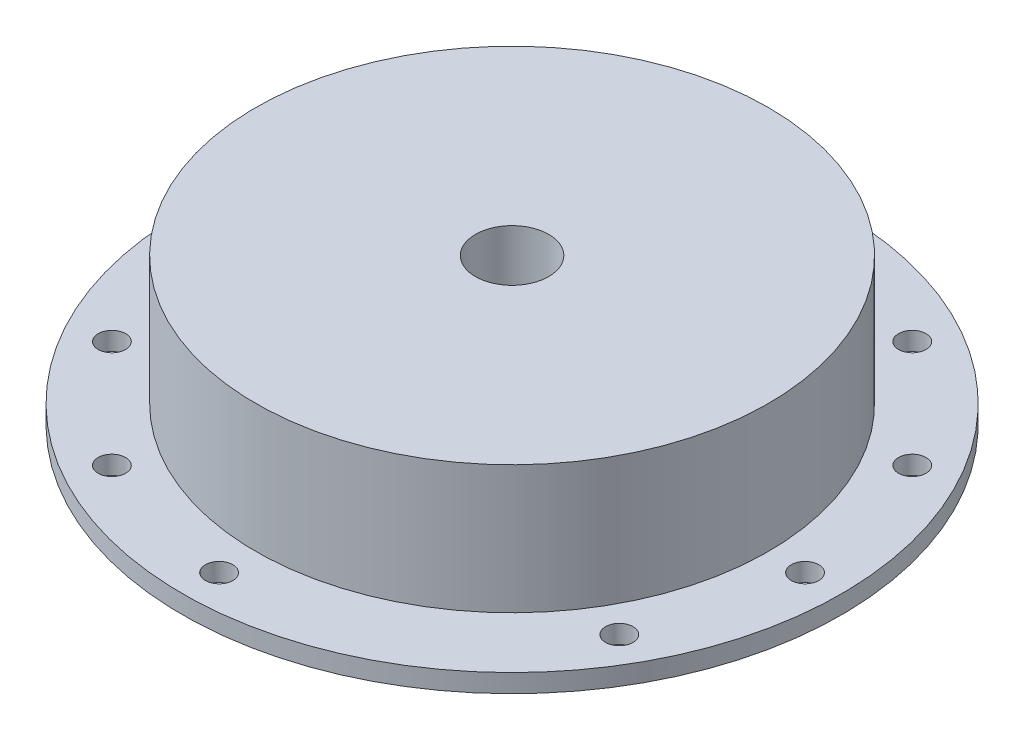
ISO-10303-21;
HEADER;
FILE_DESCRIPTION(('STEP AP214'),'2;1');
FILE_NAME('part.step','',(''),(''),'','','');
FILE_SCHEMA(('AUTOMOTIVE_DESIGN { 1 0 10303 214 1 1 1 1 }'));
ENDSEC;
DATA;
#1=APPLICATION_CONTEXT('core data for automotive mechanical design processes');
#2=APPLICATION_PROTOCOL_DEFINITION('international standard','automotive_design',2000,#1);
#3=PRODUCT_CONTEXT('',#1,'mechanical');
#4=PRODUCT('Part','Part','',(#3));
#5=PRODUCT_RELATED_PRODUCT_CATEGORY('part','',(#4));
#6=PRODUCT_DEFINITION_FORMATION('','',#4);
#7=PRODUCT_DEFINITION_CONTEXT('part definition',#1,'design');
#8=PRODUCT_DEFINITION('design','',#6,#7);
#9=PRODUCT_DEFINITION_SHAPE('','',#8);
#10=(LENGTH_UNIT() NAMED_UNIT(*) SI_UNIT(.MILLI.,.METRE.));
#11=(NAMED_UNIT(*) PLANE_ANGLE_UNIT() SI_UNIT($,.RADIAN.));
#12=(NAMED_UNIT(*) SI_UNIT($,.STERADIAN.) SOLID_ANGLE_UNIT());
#13=UNCERTAINTY_MEASURE_WITH_UNIT(LENGTH_MEASURE(1.E-05),#10,'distance_accuracy_value','');
#14=(GEOMETRIC_REPRESENTATION_CONTEXT(3) GLOBAL_UNCERTAINTY_ASSIGNED_CONTEXT((#13)) GLOBAL_UNIT_ASSIGNED_CONTEXT((#10,
#11,#12)) REPRESENTATION_CONTEXT('',''));
#15=CARTESIAN_POINT('',(0.,0.,0.));
#16=DIRECTION('',(0.,0.,1.));
#17=DIRECTION('',(1.,0.,0.));
#18=AXIS2_PLACEMENT_3D('',#15,#16,#17);
#19=CARTESIAN_POINT('',(88.9,50.8,0.));
#20=DIRECTION('',(0.,1.,0.));
#21=DIRECTION('',(0.,0.,1.));
#22=AXIS2_PLACEMENT_3D('',#19,#20,#21);
#23=PLANE('',#22);
#24=CARTESIAN_POINT('',(0.,50.8,0.));
#25=DIRECTION('',(0.,-1.,0.));
#26=DIRECTION('',(0.,0.,-1.));
#27=AXIS2_PLACEMENT_3D('',#24,#25,#26);
#28=CIRCLE('',#27,12.7);
#29=CARTESIAN_POINT('',(0.,50.8,-12.7));
#30=VERTEX_POINT('',#29);
#31=EDGE_CURVE('E10',#30,#30,#28,.T.);
#32=ORIENTED_EDGE('',*,*,#31,.T.);
#33=EDGE_LOOP('',(#32));
#34=FACE_BOUND('',#33,.T.);
#35=CARTESIAN_POINT('',(0.,50.8,0.));
#36=DIRECTION('',(0.,-1.,0.));
#37=DIRECTION('',(0.,0.,-1.));
#38=AXIS2_PLACEMENT_3D('',#35,#36,#37);
#39=CIRCLE('',#38,88.9);
#40=CARTESIAN_POINT('',(0.,50.8,-88.9));
#41=VERTEX_POINT('',#40);
#42=EDGE_CURVE('E58',#41,#41,#39,.T.);
#43=ORIENTED_EDGE('',*,*,#42,.F.);
#44=EDGE_LOOP('',(#43));
#45=FACE_BOUND('',#44,.T.);
#46=ADVANCED_FACE('F33',(#34,#45),#23,.T.);
#47=CARTESIAN_POINT('',(0.,0.,0.));
#48=DIRECTION('',(0.,-1.,0.));
#49=DIRECTION('',(0.,0.,-1.));
#50=AXIS2_PLACEMENT_3D('',#47,#48,#49);
#51=CYLINDRICAL_SURFACE('',#50,12.7);
#52=CARTESIAN_POINT('',(0.,25.4,0.));
#53=DIRECTION('',(0.,-1.,0.));
#54=DIRECTION('',(0.,0.,-1.));
#55=AXIS2_PLACEMENT_3D('',#52,#53,#54);
#56=CIRCLE('',#55,12.7);
#57=CARTESIAN_POINT('',(0.,25.4,-12.7));
#58=VERTEX_POINT('',#57);
#59=EDGE_CURVE('E39',#58,#58,#56,.T.);
#60=ORIENTED_EDGE('',*,*,#59,.T.);
#61=EDGE_LOOP('',(#60));
#62=FACE_BOUND('',#61,.T.);
#63=ORIENTED_EDGE('',*,*,#31,.F.);
#64=EDGE_LOOP('',(#63));
#65=FACE_BOUND('',#64,.T.);
#66=ADVANCED_FACE('F175',(#62,#65),#51,.F.);
#67=CARTESIAN_POINT('',(0.,63.5,0.));
#68=DIRECTION('',(0.,-1.,0.));
#69=DIRECTION('',(0.,0.,-1.));
#70=AXIS2_PLACEMENT_3D('',#67,#68,#69);
#71=DEGENERATE_TOROIDAL_SURFACE('',#70,63.5,63.5,.T.);
#72=CARTESIAN_POINT('',(0.,0.,0.));
#73=DIRECTION('',(0.,-1.,0.));
#74=DIRECTION('',(0.,0.,-1.));
#75=AXIS2_PLACEMENT_3D('',#72,#73,#74);
#76=CIRCLE('',#75,63.5);
#77=CARTESIAN_POINT('',(0.,0.,-63.5));
#78=VERTEX_POINT('',#77);
#79=EDGE_CURVE('E43',#78,#78,#76,.T.);
#80=ORIENTED_EDGE('',*,*,#79,.T.);
#81=EDGE_LOOP('',(#80));
#82=FACE_BOUND('',#81,.T.);
#83=ORIENTED_EDGE('',*,*,#59,.F.);
#84=EDGE_LOOP('',(#83));
#85=FACE_BOUND('',#84,.T.);
#86=ADVANCED_FACE('F168',(#82,#85),#71,.T.);
#87=CARTESIAN_POINT('',(63.5,0.,0.));
#88=DIRECTION('',(0.,-1.,0.));
#89=DIRECTION('',(0.,0.,-1.));
#90=AXIS2_PLACEMENT_3D('',#87,#88,#89);
#91=PLANE('',#90);
#92=CARTESIAN_POINT('',(-50.7999999999989,0.,87.9881810244996));
#93=DIRECTION('',(0.,1.,0.));
#94=DIRECTION('',(0.,0.,1.));
#95=AXIS2_PLACEMENT_3D('',#92,#93,#94);
#96=CIRCLE('',#95,4.76249999999999);
#97=CARTESIAN_POINT('',(-50.7999999999989,0.,92.7506810244996));
#98=VERTEX_POINT('',#97);
#99=EDGE_CURVE('E121',#98,#98,#96,.T.);
#100=ORIENTED_EDGE('',*,*,#99,.T.);
#101=EDGE_LOOP('',(#100));
#102=FACE_BOUND('',#101,.T.);
#103=CARTESIAN_POINT('',(-87.9881810244984,0.,50.800000000001));
#104=DIRECTION('',(0.,1.,0.));
#105=DIRECTION('',(0.,0.,1.));
#106=AXIS2_PLACEMENT_3D('',#103,#104,#105);
#107=CIRCLE('',#106,4.76249999999999);
#108=CARTESIAN_POINT('',(-87.9881810244984,0.,55.562500000001));
#109=VERTEX_POINT('',#108);
#110=EDGE_CURVE('E115',#109,#109,#107,.T.);
#111=ORIENTED_EDGE('',*,*,#110,.T.);
#112=EDGE_LOOP('',(#111));
#113=FACE_BOUND('',#112,.T.);
#114=CARTESIAN_POINT('',(-101.6,0.,1.07664592355872E-12));
#115=DIRECTION('',(0.,1.,0.));
#116=DIRECTION('',(0.,0.,1.));
#117=AXIS2_PLACEMENT_3D('',#114,#115,#116);
#118=CIRCLE('',#117,4.76249999999999);
#119=CARTESIAN_POINT('',(-101.6,0.,4.76250000000107));
#120=VERTEX_POINT('',#119);
#121=EDGE_CURVE('E109',#120,#120,#118,.T.);
#122=ORIENTED_EDGE('',*,*,#121,.T.);
#123=EDGE_LOOP('',(#122));
#124=FACE_BOUND('',#123,.T.);
#125=CARTESIAN_POINT('',(-87.9881810244994,0.,-50.7999999999992));
#126=DIRECTION('',(0.,1.,0.));
#127=DIRECTION('',(0.,0.,1.));
#128=AXIS2_PLACEMENT_3D('',#125,#126,#127);
#129=CIRCLE('',#128,4.76249999999999);
#130=CARTESIAN_POINT('',(-87.9881810244994,0.,-46.0374999999992));
#131=VERTEX_POINT('',#130);
#132=EDGE_CURVE('E103',#131,#131,#129,.T.);
#133=ORIENTED_EDGE('',*,*,#132,.T.);
#134=EDGE_LOOP('',(#133));
#135=FACE_BOUND('',#134,.T.);
#136=CARTESIAN_POINT('',(-50.8000000000007,0.,-87.9881810244986));
#137=DIRECTION('',(0.,1.,0.));
#138=DIRECTION('',(0.,0.,1.));
#139=AXIS2_PLACEMENT_3D('',#136,#137,#138);
#140=CIRCLE('',#139,4.76249999999999);
#141=CARTESIAN_POINT('',(-50.8000000000007,0.,-83.2256810244986));
#142=VERTEX_POINT('',#141);
#143=EDGE_CURVE('E97',#142,#142,#140,.T.);
#144=ORIENTED_EDGE('',*,*,#143,.T.);
#145=EDGE_LOOP('',(#144));
#146=FACE_BOUND('',#145,.T.);
#147=CARTESIAN_POINT('',(0.,0.,-101.6));
#148=DIRECTION('',(0.,1.,0.));
#149=DIRECTION('',(0.,0.,1.));
#150=AXIS2_PLACEMENT_3D('',#147,#148,#149);
#151=CIRCLE('',#150,4.76249999999999);
#152=CARTESIAN_POINT('',(0.,0.,-96.8375));
#153=VERTEX_POINT('',#152);
#154=EDGE_CURVE('E91',#153,#153,#151,.T.);
#155=ORIENTED_EDGE('',*,*,#154,.T.);
#156=EDGE_LOOP('',(#155));
#157=FACE_BOUND('',#156,.T.);
#158=CARTESIAN_POINT('',(50.7999999999995,0.,-87.9881810244993));
#159=DIRECTION('',(0.,1.,0.));
#160=DIRECTION('',(0.,0.,1.));
#161=AXIS2_PLACEMENT_3D('',#158,#159,#160);
#162=CIRCLE('',#161,4.76249999999999);
#163=CARTESIAN_POINT('',(50.7999999999995,0.,-83.2256810244993));
#164=VERTEX_POINT('',#163);
#165=EDGE_CURVE('E85',#164,#164,#162,.T.);
#166=ORIENTED_EDGE('',*,*,#165,.T.);
#167=EDGE_LOOP('',(#166));
#168=FACE_BOUND('',#167,.T.);
#169=CARTESIAN_POINT('',(87.9881810244987,0.,-50.8000000000004));
#170=DIRECTION('',(0.,1.,0.));
#171=DIRECTION('',(0.,0.,1.));
#172=AXIS2_PLACEMENT_3D('',#169,#170,#171);
#173=CIRCLE('',#172,4.76249999999999);
#174=CARTESIAN_POINT('',(87.9881810244987,0.,-46.0375000000004));
#175=VERTEX_POINT('',#174);
#176=EDGE_CURVE('E79',#175,#175,#173,.T.);
#177=ORIENTED_EDGE('',*,*,#176,.T.);
#178=EDGE_LOOP('',(#177));
#179=FACE_BOUND('',#178,.T.);
#180=CARTESIAN_POINT('',(101.6,0.,-3.67176915505799E-13));
#181=DIRECTION('',(0.,1.,0.));
#182=DIRECTION('',(0.,0.,1.));
#183=AXIS2_PLACEMENT_3D('',#180,#181,#182);
#184=CIRCLE('',#183,4.76249999999999);
#185=CARTESIAN_POINT('',(101.6,0.,4.76249999999962));
#186=VERTEX_POINT('',#185);
#187=EDGE_CURVE('E73',#186,#186,#184,.T.);
#188=ORIENTED_EDGE('',*,*,#187,.T.);
#189=EDGE_LOOP('',(#188));
#190=FACE_BOUND('',#189,.T.);
#191=CARTESIAN_POINT('',(87.9881810244991,0.,50.7999999999998));
#192=DIRECTION('',(0.,1.,0.));
#193=DIRECTION('',(0.,0.,1.));
#194=AXIS2_PLACEMENT_3D('',#191,#192,#193);
#195=CIRCLE('',#194,4.76249999999999);
#196=CARTESIAN_POINT('',(87.9881810244991,0.,55.5624999999998));
#197=VERTEX_POINT('',#196);
#198=EDGE_CURVE('E67',#197,#197,#195,.T.);
#199=ORIENTED_EDGE('',*,*,#198,.T.);
#200=EDGE_LOOP('',(#199));
#201=FACE_BOUND('',#200,.T.);
#202=CARTESIAN_POINT('',(0.,0.,101.6));
#203=DIRECTION('',(0.,1.,0.));
#204=DIRECTION('',(0.,0.,1.));
#205=AXIS2_PLACEMENT_3D('',#202,#203,#204);
#206=CIRCLE('',#205,4.76249999999999);
#207=CARTESIAN_POINT('',(0.,0.,106.3625));
#208=VERTEX_POINT('',#207);
#209=EDGE_CURVE('E61',#208,#208,#206,.T.);
#210=ORIENTED_EDGE('',*,*,#209,.T.);
#211=EDGE_LOOP('',(#210));
#212=FACE_BOUND('',#211,.T.);
#213=CARTESIAN_POINT('',(0.,0.,0.));
#214=DIRECTION('',(0.,-1.,0.));
#215=DIRECTION('',(0.,0.,-1.));
#216=AXIS2_PLACEMENT_3D('',#213,#214,#215);
#217=CIRCLE('',#216,114.3);
#218=CARTESIAN_POINT('',(0.,0.,-114.3));
#219=VERTEX_POINT('',#218);
#220=EDGE_CURVE('E47',#219,#219,#217,.T.);
#221=ORIENTED_EDGE('',*,*,#220,.T.);
#222=EDGE_LOOP('',(#221));
#223=FACE_BOUND('',#222,.T.);
#224=ORIENTED_EDGE('',*,*,#79,.F.);
#225=EDGE_LOOP('',(#224));
#226=FACE_BOUND('',#225,.T.);
#227=ADVANCED_FACE('F162',(#102,#113,#124,#135,#146,#157,#168,#179,#190,#201,#212,#223,#226),
#91,.T.);
#228=CARTESIAN_POINT('',(0.,0.,0.));
#229=DIRECTION('',(0.,-1.,0.));
#230=DIRECTION('',(0.,0.,-1.));
#231=AXIS2_PLACEMENT_3D('',#228,#229,#230);
#232=CYLINDRICAL_SURFACE('',#231,114.3);
#233=CARTESIAN_POINT('',(0.,6.35,0.));
#234=DIRECTION('',(0.,-1.,0.));
#235=DIRECTION('',(0.,0.,-1.));
#236=AXIS2_PLACEMENT_3D('',#233,#234,#235);
#237=CIRCLE('',#236,114.3);
#238=CARTESIAN_POINT('',(0.,6.35,-114.3));
#239=VERTEX_POINT('',#238);
#240=EDGE_CURVE('E52',#239,#239,#237,.T.);
#241=ORIENTED_EDGE('',*,*,#240,.T.);
#242=EDGE_LOOP('',(#241));
#243=FACE_BOUND('',#242,.T.);
#244=ORIENTED_EDGE('',*,*,#220,.F.);
#245=EDGE_LOOP('',(#244));
#246=FACE_BOUND('',#245,.T.);
#247=ADVANCED_FACE('F134',(#243,#246),#232,.T.);
#248=CARTESIAN_POINT('',(114.3,6.35,0.));
#249=DIRECTION('',(0.,1.,0.));
#250=DIRECTION('',(0.,0.,1.));
#251=AXIS2_PLACEMENT_3D('',#248,#249,#250);
#252=PLANE('',#251);
#253=CARTESIAN_POINT('',(-50.7999999999989,6.35,87.9881810244996));
#254=DIRECTION('',(0.,1.,0.));
#255=DIRECTION('',(0.,0.,1.));
#256=AXIS2_PLACEMENT_3D('',#253,#254,#255);
#257=CIRCLE('',#256,4.76249999999999);
#258=CARTESIAN_POINT('',(-50.7999999999989,6.35,92.7506810244996));
#259=VERTEX_POINT('',#258);
#260=EDGE_CURVE('E124',#259,#259,#257,.T.);
#261=ORIENTED_EDGE('',*,*,#260,.F.);
#262=EDGE_LOOP('',(#261));
#263=FACE_BOUND('',#262,.T.);
#264=CARTESIAN_POINT('',(-87.9881810244984,6.35,50.800000000001));
#265=DIRECTION('',(0.,1.,0.));
#266=DIRECTION('',(0.,0.,1.));
#267=AXIS2_PLACEMENT_3D('',#264,#265,#266);
#268=CIRCLE('',#267,4.76249999999999);
#269=CARTESIAN_POINT('',(-87.9881810244984,6.35,55.562500000001));
#270=VERTEX_POINT('',#269);
#271=EDGE_CURVE('E118',#270,#270,#268,.T.);
#272=ORIENTED_EDGE('',*,*,#271,.F.);
#273=EDGE_LOOP('',(#272));
#274=FACE_BOUND('',#273,.T.);
#275=CARTESIAN_POINT('',(-101.6,6.35,1.07664592355872E-12));
#276=DIRECTION('',(0.,1.,0.));
#277=DIRECTION('',(0.,0.,1.));
#278=AXIS2_PLACEMENT_3D('',#275,#276,#277);
#279=CIRCLE('',#278,4.76249999999999);
#280=CARTESIAN_POINT('',(-101.6,6.35,4.76250000000107));
#281=VERTEX_POINT('',#280);
#282=EDGE_CURVE('E112',#281,#281,#279,.T.);
#283=ORIENTED_EDGE('',*,*,#282,.F.);
#284=EDGE_LOOP('',(#283));
#285=FACE_BOUND('',#284,.T.);
#286=CARTESIAN_POINT('',(-87.9881810244994,6.35,-50.7999999999992));
#287=DIRECTION('',(0.,1.,0.));
#288=DIRECTION('',(0.,0.,1.));
#289=AXIS2_PLACEMENT_3D('',#286,#287,#288);
#290=CIRCLE('',#289,4.76249999999999);
#291=CARTESIAN_POINT('',(-87.9881810244994,6.35,-46.0374999999992));
#292=VERTEX_POINT('',#291);
#293=EDGE_CURVE('E106',#292,#292,#290,.T.);
#294=ORIENTED_EDGE('',*,*,#293,.F.);
#295=EDGE_LOOP('',(#294));
#296=FACE_BOUND('',#295,.T.);
#297=CARTESIAN_POINT('',(-50.8000000000007,6.35,-87.9881810244986));
#298=DIRECTION('',(0.,1.,0.));
#299=DIRECTION('',(0.,0.,1.));
#300=AXIS2_PLACEMENT_3D('',#297,#298,#299);
#301=CIRCLE('',#300,4.76249999999999);
#302=CARTESIAN_POINT('',(-50.8000000000007,6.35,-83.2256810244986));
#303=VERTEX_POINT('',#302);
#304=EDGE_CURVE('E100',#303,#303,#301,.T.);
#305=ORIENTED_EDGE('',*,*,#304,.F.);
#306=EDGE_LOOP('',(#305));
#307=FACE_BOUND('',#306,.T.);
#308=CARTESIAN_POINT('',(0.,6.35,-101.6));
#309=DIRECTION('',(0.,1.,0.));
#310=DIRECTION('',(0.,0.,1.));
#311=AXIS2_PLACEMENT_3D('',#308,#309,#310);
#312=CIRCLE('',#311,4.76249999999999);
#313=CARTESIAN_POINT('',(0.,6.35,-96.8375));
#314=VERTEX_POINT('',#313);
#315=EDGE_CURVE('E94',#314,#314,#312,.T.);
#316=ORIENTED_EDGE('',*,*,#315,.F.);
#317=EDGE_LOOP('',(#316));
#318=FACE_BOUND('',#317,.T.);
#319=CARTESIAN_POINT('',(50.7999999999995,6.35,-87.9881810244993));
#320=DIRECTION('',(0.,1.,0.));
#321=DIRECTION('',(0.,0.,1.));
#322=AXIS2_PLACEMENT_3D('',#319,#320,#321);
#323=CIRCLE('',#322,4.76249999999999);
#324=CARTESIAN_POINT('',(50.7999999999995,6.35,-83.2256810244993));
#325=VERTEX_POINT('',#324);
#326=EDGE_CURVE('E88',#325,#325,#323,.T.);
#327=ORIENTED_EDGE('',*,*,#326,.F.);
#328=EDGE_LOOP('',(#327));
#329=FACE_BOUND('',#328,.T.);
#330=CARTESIAN_POINT('',(87.9881810244987,6.35,-50.8000000000004));
#331=DIRECTION('',(0.,1.,0.));
#332=DIRECTION('',(0.,0.,1.));
#333=AXIS2_PLACEMENT_3D('',#330,#331,#332);
#334=CIRCLE('',#333,4.76249999999999);
#335=CARTESIAN_POINT('',(87.9881810244987,6.35,-46.0375000000004));
#336=VERTEX_POINT('',#335);
#337=EDGE_CURVE('E82',#336,#336,#334,.T.);
#338=ORIENTED_EDGE('',*,*,#337,.F.);
#339=EDGE_LOOP('',(#338));
#340=FACE_BOUND('',#339,.T.);
#341=CARTESIAN_POINT('',(101.6,6.35,-3.67176915505799E-13));
#342=DIRECTION('',(0.,1.,0.));
#343=DIRECTION('',(0.,0.,1.));
#344=AXIS2_PLACEMENT_3D('',#341,#342,#343);
#345=CIRCLE('',#344,4.76249999999999);
#346=CARTESIAN_POINT('',(101.6,6.35,4.76249999999962));
#347=VERTEX_POINT('',#346);
#348=EDGE_CURVE('E76',#347,#347,#345,.T.);
#349=ORIENTED_EDGE('',*,*,#348,.F.);
#350=EDGE_LOOP('',(#349));
#351=FACE_BOUND('',#350,.T.);
#352=CARTESIAN_POINT('',(87.9881810244991,6.35,50.7999999999998));
#353=DIRECTION('',(0.,1.,0.));
#354=DIRECTION('',(0.,0.,1.));
#355=AXIS2_PLACEMENT_3D('',#352,#353,#354);
#356=CIRCLE('',#355,4.76249999999999);
#357=CARTESIAN_POINT('',(87.9881810244991,6.35,55.5624999999998));
#358=VERTEX_POINT('',#357);
#359=EDGE_CURVE('E70',#358,#358,#356,.T.);
#360=ORIENTED_EDGE('',*,*,#359,.F.);
#361=EDGE_LOOP('',(#360));
#362=FACE_BOUND('',#361,.T.);
#363=CARTESIAN_POINT('',(0.,6.35,101.6));
#364=DIRECTION('',(0.,1.,0.));
#365=DIRECTION('',(0.,0.,1.));
#366=AXIS2_PLACEMENT_3D('',#363,#364,#365);
#367=CIRCLE('',#366,4.76249999999999);
#368=CARTESIAN_POINT('',(0.,6.35,106.3625));
#369=VERTEX_POINT('',#368);
#370=EDGE_CURVE('E64',#369,#369,#367,.T.);
#371=ORIENTED_EDGE('',*,*,#370,.F.);
#372=EDGE_LOOP('',(#371));
#373=FACE_BOUND('',#372,.T.);
#374=CARTESIAN_POINT('',(0.,6.35,0.));
#375=DIRECTION('',(0.,-1.,0.));
#376=DIRECTION('',(0.,0.,-1.));
#377=AXIS2_PLACEMENT_3D('',#374,#375,#376);
#378=CIRCLE('',#377,88.9);
#379=CARTESIAN_POINT('',(0.,6.35,-88.9));
#380=VERTEX_POINT('',#379);
#381=EDGE_CURVE('E55',#380,#380,#378,.T.);
#382=ORIENTED_EDGE('',*,*,#381,.T.);
#383=EDGE_LOOP('',(#382));
#384=FACE_BOUND('',#383,.T.);
#385=ORIENTED_EDGE('',*,*,#240,.F.);
#386=EDGE_LOOP('',(#385));
#387=FACE_BOUND('',#386,.T.);
#388=ADVANCED_FACE('F130',(#263,#274,#285,#296,#307,#318,#329,#340,#351,#362,#373,#384,#387),
#252,.T.);
#389=CARTESIAN_POINT('',(0.,0.,0.));
#390=DIRECTION('',(0.,-1.,0.));
#391=DIRECTION('',(0.,0.,-1.));
#392=AXIS2_PLACEMENT_3D('',#389,#390,#391);
#393=CYLINDRICAL_SURFACE('',#392,88.9);
#394=ORIENTED_EDGE('',*,*,#42,.T.);
#395=EDGE_LOOP('',(#394));
#396=FACE_BOUND('',#395,.T.);
#397=ORIENTED_EDGE('',*,*,#381,.F.);
#398=EDGE_LOOP('',(#397));
#399=FACE_BOUND('',#398,.T.);
#400=ADVANCED_FACE('F133',(#396,#399),#393,.T.);
#401=CARTESIAN_POINT('',(0.,6.35,101.6));
#402=DIRECTION('',(0.,1.,0.));
#403=DIRECTION('',(0.,0.,1.));
#404=AXIS2_PLACEMENT_3D('',#401,#402,#403);
#405=CYLINDRICAL_SURFACE('',#404,4.76249999999999);
#406=ORIENTED_EDGE('',*,*,#209,.F.);
#407=EDGE_LOOP('',(#406));
#408=FACE_BOUND('',#407,.T.);
#409=ORIENTED_EDGE('',*,*,#370,.T.);
#410=EDGE_LOOP('',(#409));
#411=FACE_BOUND('',#410,.T.);
#412=ADVANCED_FACE('F188',(#408,#411),#405,.F.);
#413=CARTESIAN_POINT('',(87.9881810244991,6.35,50.7999999999998));
#414=DIRECTION('',(0.,1.,0.));
#415=DIRECTION('',(0.,0.,1.));
#416=AXIS2_PLACEMENT_3D('',#413,#414,#415);
#417=CYLINDRICAL_SURFACE('',#416,4.76249999999999);
#418=ORIENTED_EDGE('',*,*,#198,.F.);
#419=EDGE_LOOP('',(#418));
#420=FACE_BOUND('',#419,.T.);
#421=ORIENTED_EDGE('',*,*,#359,.T.);
#422=EDGE_LOOP('',(#421));
#423=FACE_BOUND('',#422,.T.);
#424=ADVANCED_FACE('F193',(#420,#423),#417,.F.);
#425=CARTESIAN_POINT('',(101.6,6.35,-3.67176915505799E-13));
#426=DIRECTION('',(0.,1.,0.));
#427=DIRECTION('',(0.,0.,1.));
#428=AXIS2_PLACEMENT_3D('',#425,#426,#427);
#429=CYLINDRICAL_SURFACE('',#428,4.76249999999999);
#430=ORIENTED_EDGE('',*,*,#187,.F.);
#431=EDGE_LOOP('',(#430));
#432=FACE_BOUND('',#431,.T.);
#433=ORIENTED_EDGE('',*,*,#348,.T.);
#434=EDGE_LOOP('',(#433));
#435=FACE_BOUND('',#434,.T.);
#436=ADVANCED_FACE('F199',(#432,#435),#429,.F.);
#437=CARTESIAN_POINT('',(87.9881810244987,6.35,-50.8000000000004));
#438=DIRECTION('',(0.,1.,0.));
#439=DIRECTION('',(0.,0.,1.));
#440=AXIS2_PLACEMENT_3D('',#437,#438,#439);
#441=CYLINDRICAL_SURFACE('',#440,4.76249999999999);
#442=ORIENTED_EDGE('',*,*,#176,.F.);
#443=EDGE_LOOP('',(#442));
#444=FACE_BOUND('',#443,.T.);
#445=ORIENTED_EDGE('',*,*,#337,.T.);
#446=EDGE_LOOP('',(#445));
#447=FACE_BOUND('',#446,.T.);
#448=ADVANCED_FACE('F203',(#444,#447),#441,.F.);
#449=CARTESIAN_POINT('',(50.7999999999995,6.35,-87.9881810244993));
#450=DIRECTION('',(0.,1.,0.));
#451=DIRECTION('',(0.,0.,1.));
#452=AXIS2_PLACEMENT_3D('',#449,#450,#451);
#453=CYLINDRICAL_SURFACE('',#452,4.76249999999999);
#454=ORIENTED_EDGE('',*,*,#165,.F.);
#455=EDGE_LOOP('',(#454));
#456=FACE_BOUND('',#455,.T.);
#457=ORIENTED_EDGE('',*,*,#326,.T.);
#458=EDGE_LOOP('',(#457));
#459=FACE_BOUND('',#458,.T.);
#460=ADVANCED_FACE('F207',(#456,#459),#453,.F.);
#461=CARTESIAN_POINT('',(0.,6.35,-101.6));
#462=DIRECTION('',(0.,1.,0.));
#463=DIRECTION('',(0.,0.,1.));
#464=AXIS2_PLACEMENT_3D('',#461,#462,#463);
#465=CYLINDRICAL_SURFACE('',#464,4.76249999999999);
#466=ORIENTED_EDGE('',*,*,#154,.F.);
#467=EDGE_LOOP('',(#466));
#468=FACE_BOUND('',#467,.T.);
#469=ORIENTED_EDGE('',*,*,#315,.T.);
#470=EDGE_LOOP('',(#469));
#471=FACE_BOUND('',#470,.T.);
#472=ADVANCED_FACE('F211',(#468,#471),#465,.F.);
#473=CARTESIAN_POINT('',(-50.8000000000007,6.35,-87.9881810244986));
#474=DIRECTION('',(0.,1.,0.));
#475=DIRECTION('',(0.,0.,1.));
#476=AXIS2_PLACEMENT_3D('',#473,#474,#475);
#477=CYLINDRICAL_SURFACE('',#476,4.76249999999999);
#478=ORIENTED_EDGE('',*,*,#143,.F.);
#479=EDGE_LOOP('',(#478));
#480=FACE_BOUND('',#479,.T.);
#481=ORIENTED_EDGE('',*,*,#304,.T.);
#482=EDGE_LOOP('',(#481));
#483=FACE_BOUND('',#482,.T.);
#484=ADVANCED_FACE('F215',(#480,#483),#477,.F.);
#485=CARTESIAN_POINT('',(-87.9881810244994,6.35,-50.7999999999992));
#486=DIRECTION('',(0.,1.,0.));
#487=DIRECTION('',(0.,0.,1.));
#488=AXIS2_PLACEMENT_3D('',#485,#486,#487);
#489=CYLINDRICAL_SURFACE('',#488,4.76249999999999);
#490=ORIENTED_EDGE('',*,*,#132,.F.);
#491=EDGE_LOOP('',(#490));
#492=FACE_BOUND('',#491,.T.);
#493=ORIENTED_EDGE('',*,*,#293,.T.);
#494=EDGE_LOOP('',(#493));
#495=FACE_BOUND('',#494,.T.);
#496=ADVANCED_FACE('F219',(#492,#495),#489,.F.);
#497=CARTESIAN_POINT('',(-101.6,6.35,1.07664592355872E-12));
#498=DIRECTION('',(0.,1.,0.));
#499=DIRECTION('',(0.,0.,1.));
#500=AXIS2_PLACEMENT_3D('',#497,#498,#499);
#501=CYLINDRICAL_SURFACE('',#500,4.76249999999999);
#502=ORIENTED_EDGE('',*,*,#121,.F.);
#503=EDGE_LOOP('',(#502));
#504=FACE_BOUND('',#503,.T.);
#505=ORIENTED_EDGE('',*,*,#282,.T.);
#506=EDGE_LOOP('',(#505));
#507=FACE_BOUND('',#506,.T.);
#508=ADVANCED_FACE('F223',(#504,#507),#501,.F.);
#509=CARTESIAN_POINT('',(-87.9881810244984,6.35,50.800000000001));
#510=DIRECTION('',(0.,1.,0.));
#511=DIRECTION('',(0.,0.,1.));
#512=AXIS2_PLACEMENT_3D('',#509,#510,#511);
#513=CYLINDRICAL_SURFACE('',#512,4.76249999999999);
#514=ORIENTED_EDGE('',*,*,#110,.F.);
#515=EDGE_LOOP('',(#514));
#516=FACE_BOUND('',#515,.T.);
#517=ORIENTED_EDGE('',*,*,#271,.T.);
#518=EDGE_LOOP('',(#517));
#519=FACE_BOUND('',#518,.T.);
#520=ADVANCED_FACE('F227',(#516,#519),#513,.F.);
#521=CARTESIAN_POINT('',(-50.7999999999989,6.35,87.9881810244996));
#522=DIRECTION('',(0.,1.,0.));
#523=DIRECTION('',(0.,0.,1.));
#524=AXIS2_PLACEMENT_3D('',#521,#522,#523);
#525=CYLINDRICAL_SURFACE('',#524,4.76249999999999);
#526=ORIENTED_EDGE('',*,*,#99,.F.);
#527=EDGE_LOOP('',(#526));
#528=FACE_BOUND('',#527,.T.);
#529=ORIENTED_EDGE('',*,*,#260,.T.);
#530=EDGE_LOOP('',(#529));
#531=FACE_BOUND('',#530,.T.);
#532=ADVANCED_FACE('F128',(#528,#531),#525,.F.);
#533=CLOSED_SHELL('',(#46,#66,#86,#227,#247,#388,#400,#412,#424,#436,#448,#460,#472,#484,#496,
#508,#520,#532));
#534=MANIFOLD_SOLID_BREP('B2',#533);
#535=ADVANCED_BREP_SHAPE_REPRESENTATION('',(#18,#534),#14);
#536=SHAPE_DEFINITION_REPRESENTATION(#9,#535);
ENDSEC;
END-ISO-10303-21;
